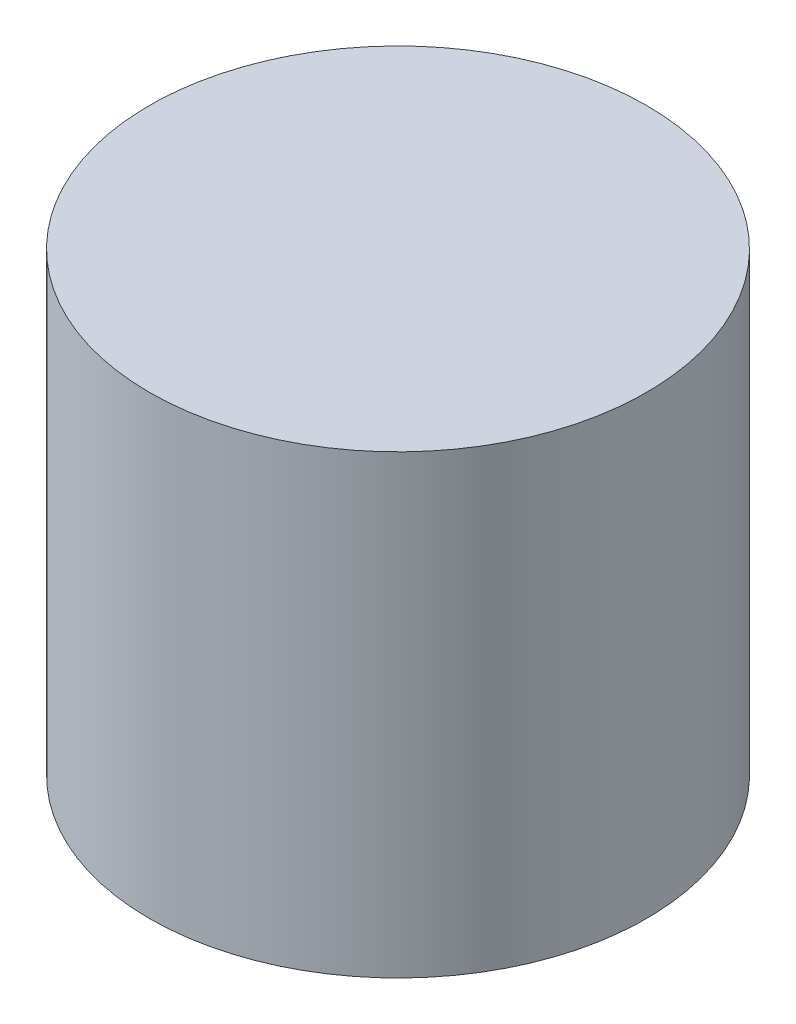
ISO-10303-21;
HEADER;
FILE_DESCRIPTION(('STEP AP214'),'2;1');
FILE_NAME('part.step','',(''),(''),'','','');
FILE_SCHEMA(('AUTOMOTIVE_DESIGN { 1 0 10303 214 1 1 1 1 }'));
ENDSEC;
DATA;
#1=APPLICATION_CONTEXT('core data for automotive mechanical design processes');
#2=APPLICATION_PROTOCOL_DEFINITION('international standard','automotive_design',2000,#1);
#3=PRODUCT_CONTEXT('',#1,'mechanical');
#4=PRODUCT('Part','Part','',(#3));
#5=PRODUCT_RELATED_PRODUCT_CATEGORY('part','',(#4));
#6=PRODUCT_DEFINITION_FORMATION('','',#4);
#7=PRODUCT_DEFINITION_CONTEXT('part definition',#1,'design');
#8=PRODUCT_DEFINITION('design','',#6,#7);
#9=PRODUCT_DEFINITION_SHAPE('','',#8);
#10=(LENGTH_UNIT() NAMED_UNIT(*) SI_UNIT(.MILLI.,.METRE.));
#11=(NAMED_UNIT(*) PLANE_ANGLE_UNIT() SI_UNIT($,.RADIAN.));
#12=(NAMED_UNIT(*) SI_UNIT($,.STERADIAN.) SOLID_ANGLE_UNIT());
#13=UNCERTAINTY_MEASURE_WITH_UNIT(LENGTH_MEASURE(1.E-05),#10,'distance_accuracy_value','');
#14=(GEOMETRIC_REPRESENTATION_CONTEXT(3) GLOBAL_UNCERTAINTY_ASSIGNED_CONTEXT((#13)) GLOBAL_UNIT_ASSIGNED_CONTEXT((#10,
#11,#12)) REPRESENTATION_CONTEXT('',''));
#15=CARTESIAN_POINT('',(0.,0.,0.));
#16=DIRECTION('',(0.,0.,1.));
#17=DIRECTION('',(1.,0.,0.));
#18=AXIS2_PLACEMENT_3D('',#15,#16,#17);
#19=CARTESIAN_POINT('',(0.,11.,0.));
#20=DIRECTION('',(0.,-1.,0.));
#21=DIRECTION('',(0.,0.,-1.));
#22=AXIS2_PLACEMENT_3D('',#19,#20,#21);
#23=CYLINDRICAL_SURFACE('',#22,6.);
#24=CARTESIAN_POINT('',(0.,11.,0.));
#25=DIRECTION('',(0.,1.,0.));
#26=DIRECTION('',(0.,0.,1.));
#27=AXIS2_PLACEMENT_3D('',#24,#25,#26);
#28=CIRCLE('',#27,6.);
#29=CARTESIAN_POINT('',(0.,11.,6.));
#30=VERTEX_POINT('',#29);
#31=EDGE_CURVE('E10',#30,#30,#28,.T.);
#32=ORIENTED_EDGE('',*,*,#31,.F.);
#33=EDGE_LOOP('',(#32));
#34=FACE_BOUND('',#33,.T.);
#35=CARTESIAN_POINT('',(0.,0.,0.));
#36=DIRECTION('',(0.,1.,0.));
#37=DIRECTION('',(0.,0.,1.));
#38=AXIS2_PLACEMENT_3D('',#35,#36,#37);
#39=CIRCLE('',#38,6.);
#40=CARTESIAN_POINT('',(0.,0.,6.));
#41=VERTEX_POINT('',#40);
#42=EDGE_CURVE('E37',#41,#41,#39,.T.);
#43=ORIENTED_EDGE('',*,*,#42,.T.);
#44=EDGE_LOOP('',(#43));
#45=FACE_BOUND('',#44,.T.);
#46=ADVANCED_FACE('F40',(#34,#45),#23,.T.);
#47=CARTESIAN_POINT('',(0.,11.,0.));
#48=DIRECTION('',(0.,1.,0.));
#49=DIRECTION('',(0.,0.,1.));
#50=AXIS2_PLACEMENT_3D('',#47,#48,#49);
#51=PLANE('',#50);
#52=ORIENTED_EDGE('',*,*,#31,.T.);
#53=EDGE_LOOP('',(#52));
#54=FACE_BOUND('',#53,.T.);
#55=ADVANCED_FACE('F55',(#54),#51,.T.);
#56=CARTESIAN_POINT('',(0.,0.,0.));
#57=DIRECTION('',(0.,1.,0.));
#58=DIRECTION('',(0.,0.,1.));
#59=AXIS2_PLACEMENT_3D('',#56,#57,#58);
#60=PLANE('',#59);
#61=ORIENTED_EDGE('',*,*,#42,.F.);
#62=EDGE_LOOP('',(#61));
#63=FACE_BOUND('',#62,.T.);
#64=ADVANCED_FACE('F49',(#63),#60,.F.);
#65=CLOSED_SHELL('',(#46,#55,#64));
#66=MANIFOLD_SOLID_BREP('B2',#65);
#67=ADVANCED_BREP_SHAPE_REPRESENTATION('',(#18,#66),#14);
#68=SHAPE_DEFINITION_REPRESENTATION(#9,#67);
ENDSEC;
END-ISO-10303-21;
